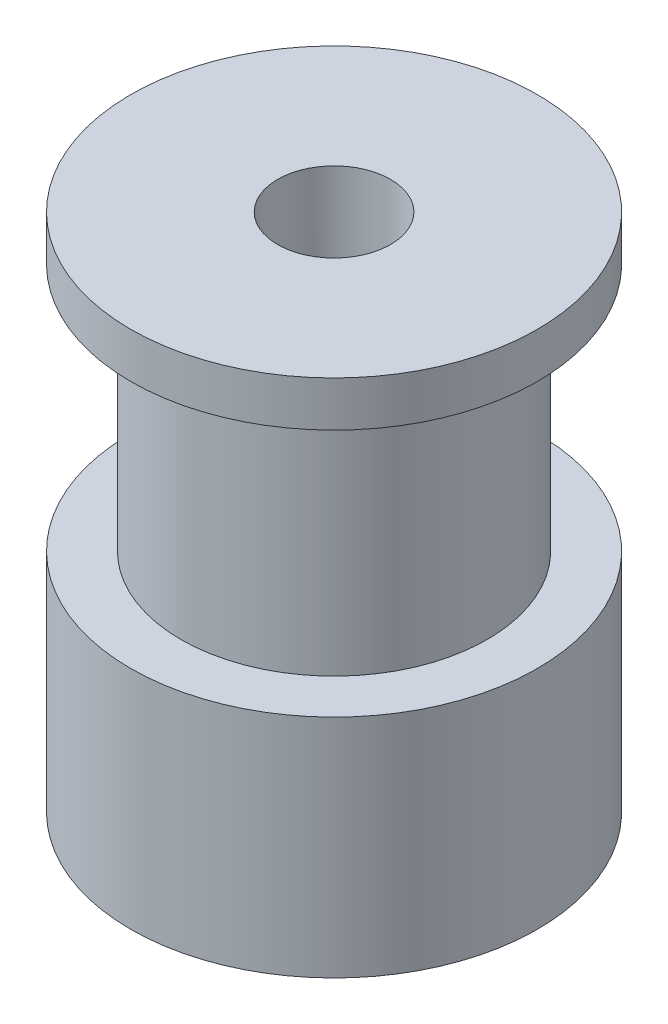
ISO-10303-21;
HEADER;
FILE_DESCRIPTION(('STEP AP214'),'2;1');
FILE_NAME('part.step','',(''),(''),'','','');
FILE_SCHEMA(('AUTOMOTIVE_DESIGN { 1 0 10303 214 1 1 1 1 }'));
ENDSEC;
DATA;
#1=APPLICATION_CONTEXT('core data for automotive mechanical design processes');
#2=APPLICATION_PROTOCOL_DEFINITION('international standard','automotive_design',2000,#1);
#3=PRODUCT_CONTEXT('',#1,'mechanical');
#4=PRODUCT('Part','Part','',(#3));
#5=PRODUCT_RELATED_PRODUCT_CATEGORY('part','',(#4));
#6=PRODUCT_DEFINITION_FORMATION('','',#4);
#7=PRODUCT_DEFINITION_CONTEXT('part definition',#1,'design');
#8=PRODUCT_DEFINITION('design','',#6,#7);
#9=PRODUCT_DEFINITION_SHAPE('','',#8);
#10=(LENGTH_UNIT() NAMED_UNIT(*) SI_UNIT(.MILLI.,.METRE.));
#11=(NAMED_UNIT(*) PLANE_ANGLE_UNIT() SI_UNIT($,.RADIAN.));
#12=(NAMED_UNIT(*) SI_UNIT($,.STERADIAN.) SOLID_ANGLE_UNIT());
#13=UNCERTAINTY_MEASURE_WITH_UNIT(LENGTH_MEASURE(1.E-05),#10,'distance_accuracy_value','');
#14=(GEOMETRIC_REPRESENTATION_CONTEXT(3) GLOBAL_UNCERTAINTY_ASSIGNED_CONTEXT((#13)) GLOBAL_UNIT_ASSIGNED_CONTEXT((#10,
#11,#12)) REPRESENTATION_CONTEXT('',''));
#15=CARTESIAN_POINT('',(0.,0.,0.));
#16=DIRECTION('',(0.,0.,1.));
#17=DIRECTION('',(1.,0.,0.));
#18=AXIS2_PLACEMENT_3D('',#15,#16,#17);
#19=CARTESIAN_POINT('',(0.,10.,0.));
#20=DIRECTION('',(0.,-1.,0.));
#21=DIRECTION('',(0.,0.,-1.));
#22=AXIS2_PLACEMENT_3D('',#19,#20,#21);
#23=CYLINDRICAL_SURFACE('',#22,9.);
#24=CARTESIAN_POINT('',(-9.,4.5,0.));
#25=CARTESIAN_POINT('',(-8.99999856701294,4.50000335336869,-0.0836345429749289));
#26=CARTESIAN_POINT('',(-8.9988220674782,4.50701836498135,-0.167314729103292));
#27=CARTESIAN_POINT('',(-8.99424206964832,4.53488139525919,-0.332328133003826));
#28=CARTESIAN_POINT('',(-8.99083652354334,4.55574213414696,-0.413659120775548));
#29=CARTESIAN_POINT('',(-8.9821804094187,4.61064926915565,-0.571562848327586));
#30=CARTESIAN_POINT('',(-8.97693135095516,4.64468487938434,-0.64813942105914));
#31=CARTESIAN_POINT('',(-8.96516536249242,4.72494737523144,-0.794485105186767));
#32=CARTESIAN_POINT('',(-8.9586485775266,4.7711728664898,-0.864254993927154));
#33=CARTESIAN_POINT('',(-8.94499990474988,4.87497305029228,-0.995683568575008));
#34=CARTESIAN_POINT('',(-8.93786323088914,4.93264146878168,-1.05726774212098));
#35=CARTESIAN_POINT('',(-8.92381576126039,5.05748878108369,-1.16993309919596));
#36=CARTESIAN_POINT('',(-8.916904979776,5.12466827487397,-1.22101361963458));
#37=CARTESIAN_POINT('',(-8.90404539455868,5.26714257971823,-1.31152027536308));
#38=CARTESIAN_POINT('',(-8.89810277454981,5.34248480208285,-1.3508727317166));
#39=CARTESIAN_POINT('',(-8.88791873876805,5.49882573858038,-1.41633501924673));
#40=CARTESIAN_POINT('',(-8.88367720808584,5.57982407020658,-1.44244574493937));
#41=CARTESIAN_POINT('',(-8.87742322105653,5.74438816491392,-1.48044862667088));
#42=CARTESIAN_POINT('',(-8.8753906109142,5.82792344190084,-1.49246941748124));
#43=CARTESIAN_POINT('',(-8.87372363361989,5.99584816613008,-1.50235003517393));
#44=CARTESIAN_POINT('',(-8.87408909674328,6.08023755250038,-1.5002108642334));
#45=CARTESIAN_POINT('',(-8.87715857318133,6.24655671676527,-1.48193705903769));
#46=CARTESIAN_POINT('',(-8.8798384399135,6.32850288212714,-1.46594692913386));
#47=CARTESIAN_POINT('',(-8.88719697126604,6.48853279069748,-1.42065188424207));
#48=CARTESIAN_POINT('',(-8.89187570443963,6.56661640133313,-1.39134651259184));
#49=CARTESIAN_POINT('',(-8.9027308760046,6.71713729406455,-1.32010634765635));
#50=CARTESIAN_POINT('',(-8.90891440264395,6.78954564364874,-1.27811154832783));
#51=CARTESIAN_POINT('',(-8.92207751049005,6.92634264032303,-1.18272721053446));
#52=CARTESIAN_POINT('',(-8.92905715592571,6.99073063947296,-1.12933675239257));
#53=CARTESIAN_POINT('',(-8.94313216727871,7.11049565148441,-1.01188932729543));
#54=CARTESIAN_POINT('',(-8.95022789538991,7.16575111112405,-0.947708378323875));
#55=CARTESIAN_POINT('',(-8.96365560838034,7.2647266575992,-0.810921149388987));
#56=CARTESIAN_POINT('',(-8.96998758833847,7.30844667010994,-0.738314815143853));
#57=CARTESIAN_POINT('',(-8.98118335735747,7.38312133628177,-0.586623549700026));
#58=CARTESIAN_POINT('',(-8.98604591044468,7.41406525159875,-0.507533235338796));
#59=CARTESIAN_POINT('',(-8.99374501807596,7.46219652914759,-0.345179007361638));
#60=CARTESIAN_POINT('',(-8.99658174210284,7.47938504218423,-0.26191544350768));
#61=CARTESIAN_POINT('',(-8.99988677905611,7.49935281507668,-0.0946259407809736));
#62=CARTESIAN_POINT('',(-9.00038251807671,7.50229894308336,-0.0106204422906062));
#63=CARTESIAN_POINT('',(-8.99902484652702,7.49414319334313,0.156683863733933));
#64=CARTESIAN_POINT('',(-8.99717152634471,7.48304185611976,0.239982698335224));
#65=CARTESIAN_POINT('',(-8.99134096162921,7.44724509039871,0.402993705328059));
#66=CARTESIAN_POINT('',(-8.98737662880786,7.42263227496592,0.482724521031228));
#67=CARTESIAN_POINT('',(-8.97776678673215,7.36059928908028,0.636928130916266));
#68=CARTESIAN_POINT('',(-8.97212118307212,7.32317839941884,0.711400629545832));
#69=CARTESIAN_POINT('',(-8.95970709781444,7.23620932518193,0.853698413681376));
#70=CARTESIAN_POINT('',(-8.95292913532213,7.18655690629965,0.92145915056229));
#71=CARTESIAN_POINT('',(-8.9390308043514,7.07667761076896,1.04774615130161));
#72=CARTESIAN_POINT('',(-8.93191041102928,7.016449966034,1.10627174381795));
#73=CARTESIAN_POINT('',(-8.91804105141507,6.88638147115715,1.2130456677948));
#74=CARTESIAN_POINT('',(-8.91129669682263,6.81644750069135,1.26118125666823));
#75=CARTESIAN_POINT('',(-8.8990291786673,6.66938821851688,1.34502138617699));
#76=CARTESIAN_POINT('',(-8.89350597639612,6.5922631348635,1.38072632086189));
#77=CARTESIAN_POINT('',(-8.88434072218623,6.43332616031272,1.43852299888389));
#78=CARTESIAN_POINT('',(-8.88069092586639,6.35153514298171,1.46067085952877));
#79=CARTESIAN_POINT('',(-8.87566630101156,6.18532792246694,1.49090127226697));
#80=CARTESIAN_POINT('',(-8.87429127469633,6.10091194816077,1.4989850471677));
#81=CARTESIAN_POINT('',(-8.87398039850406,5.93297690042255,1.50082371962841));
#82=CARTESIAN_POINT('',(-8.87501433903389,5.84945977285483,1.49475608167511));
#83=CARTESIAN_POINT('',(-8.87933868872237,5.68465245116954,1.46884790337411));
#84=CARTESIAN_POINT('',(-8.88262909056728,5.60336224983488,1.44900740766749));
#85=CARTESIAN_POINT('',(-8.89108413769031,5.44538493762443,1.39618469375694));
#86=CARTESIAN_POINT('',(-8.89624660331802,5.36869259396638,1.36321775436027));
#87=CARTESIAN_POINT('',(-8.90786621353324,5.22189859848309,1.28509620234955));
#88=CARTESIAN_POINT('',(-8.91432342233039,5.15179727377672,1.23994098524914));
#89=CARTESIAN_POINT('',(-8.92790072427373,5.01927865013535,1.13809133062329));
#90=CARTESIAN_POINT('',(-8.93502777345781,4.95696238997984,1.08126633815619));
#91=CARTESIAN_POINT('',(-8.94908623416505,4.84268903731504,0.957965418828138));
#92=CARTESIAN_POINT('',(-8.95601760015928,4.7907343388171,0.891487267747582));
#93=CARTESIAN_POINT('',(-8.96895917785332,4.69833103908003,0.750221501784169));
#94=CARTESIAN_POINT('',(-8.97496269751862,4.65796437641223,0.675379672519691));
#95=CARTESIAN_POINT('',(-8.98530700561065,4.59043830923405,0.519907841627389));
#96=CARTESIAN_POINT('',(-8.98964944906488,4.56326575135218,0.439283696898006));
#97=CARTESIAN_POINT('',(-8.99523474499773,4.528796835524,0.29862198602724));
#98=CARTESIAN_POINT('',(-8.99701216364015,4.51801531823042,0.239435298179068));
#99=CARTESIAN_POINT('',(-8.99939529591672,4.50361575729315,0.120173586191885));
#100=CARTESIAN_POINT('',(-9.00000102972385,4.49999759031758,0.0600985773650965));
#101=CARTESIAN_POINT('',(-9.,4.5,0.));
#102=B_SPLINE_CURVE_WITH_KNOTS('',3,(#24,#25,#26,#27,#28,#29,#30,#31,#32,#33,#34,#35,#36,#37,
#38,#39,#40,#41,#42,#43,#44,#45,#46,#47,#48,#49,#50,#51,#52,#53,#54,#55,#56,#57,#58,#59,#60,#61,
#62,#63,#64,#65,#66,#67,#68,#69,#70,#71,#72,#73,#74,#75,#76,#77,#78,#79,#80,#81,#82,#83,#84,#85,
#86,#87,#88,#89,#90,#91,#92,#93,#94,#95,#96,#97,#98,#99,#100,#101),.UNSPECIFIED.,.T.,.F.,(4,2,2,
2,2,2,2,2,2,2,2,2,2,2,2,2,2,2,2,2,2,2,2,2,2,2,2,2,2,2,2,2,2,2,2,2,2,2,4),(0.,0.250683950963106,
0.501598527417252,0.752308120215162,1.00298904760487,1.25581494637399,1.50865680101914,
1.76305512494304,2.01743626125709,2.26947646262054,2.52149882592532,2.77092313056245,
3.02035599015229,3.27098733979535,3.52163892408344,3.77539661946796,4.02915594981509,
4.28312813349542,4.53707906712689,4.78804730094838,5.03900587821516,5.2884468420385,
5.5379018149564,5.78956095376214,6.0412383783257,6.29552293204572,6.54979942425566,
6.80301613405063,7.05621082671971,7.3062474571362,7.5562832771288,7.80602890935734,
8.05578693017602,8.30850830516035,8.56128800327384,8.8158133896432,9.07008451278043,
9.25022548898411,9.43036336366181),.UNSPECIFIED.);
#103=CARTESIAN_POINT('',(-9.,4.5,0.));
#104=VERTEX_POINT('',#103);
#105=EDGE_CURVE('E79',#104,#104,#102,.T.);
#106=ORIENTED_EDGE('',*,*,#105,.T.);
#107=EDGE_LOOP('',(#106));
#108=FACE_BOUND('',#107,.T.);
#109=CARTESIAN_POINT('',(0.,7.5,-9.));
#110=CARTESIAN_POINT('',(-0.0836345429749289,7.49999664663131,-8.99999856701294));
#111=CARTESIAN_POINT('',(-0.167314729103292,7.49298163501865,-8.9988220674782));
#112=CARTESIAN_POINT('',(-0.332328133003826,7.46511860474081,-8.99424206964832));
#113=CARTESIAN_POINT('',(-0.413659120775548,7.44425786585304,-8.99083652354334));
#114=CARTESIAN_POINT('',(-0.571562848327586,7.38935073084435,-8.9821804094187));
#115=CARTESIAN_POINT('',(-0.64813942105914,7.35531512061566,-8.97693135095516));
#116=CARTESIAN_POINT('',(-0.794485105186767,7.27505262476856,-8.96516536249242));
#117=CARTESIAN_POINT('',(-0.864254993927155,7.2288271335102,-8.9586485775266));
#118=CARTESIAN_POINT('',(-0.995683568575008,7.12502694970772,-8.94499990474988));
#119=CARTESIAN_POINT('',(-1.05726774212098,7.06735853121832,-8.93786323088914));
#120=CARTESIAN_POINT('',(-1.16993309919596,6.94251121891631,-8.92381576126039));
#121=CARTESIAN_POINT('',(-1.22101361963458,6.87533172512603,-8.916904979776));
#122=CARTESIAN_POINT('',(-1.31152027536308,6.73285742028177,-8.90404539455868));
#123=CARTESIAN_POINT('',(-1.3508727317166,6.65751519791715,-8.89810277454981));
#124=CARTESIAN_POINT('',(-1.41633501924673,6.50117426141963,-8.88791873876805));
#125=CARTESIAN_POINT('',(-1.44244574493937,6.42017592979342,-8.88367720808584));
#126=CARTESIAN_POINT('',(-1.48044862667088,6.25561183508608,-8.87742322105653));
#127=CARTESIAN_POINT('',(-1.49246941748124,6.17207655809917,-8.8753906109142));
#128=CARTESIAN_POINT('',(-1.50235003517392,6.00415183386992,-8.87372363361989));
#129=CARTESIAN_POINT('',(-1.5002108642334,5.91976244749962,-8.87408909674328));
#130=CARTESIAN_POINT('',(-1.48193705903769,5.75344328323473,-8.87715857318133));
#131=CARTESIAN_POINT('',(-1.46594692913386,5.67149711787286,-8.8798384399135));
#132=CARTESIAN_POINT('',(-1.42065188424207,5.51146720930252,-8.88719697126604));
#133=CARTESIAN_POINT('',(-1.39134651259184,5.43338359866687,-8.89187570443963));
#134=CARTESIAN_POINT('',(-1.32010634765635,5.28286270593545,-8.9027308760046));
#135=CARTESIAN_POINT('',(-1.27811154832783,5.21045435635126,-8.90891440264395));
#136=CARTESIAN_POINT('',(-1.18272721053446,5.07365735967697,-8.92207751049005));
#137=CARTESIAN_POINT('',(-1.12933675239257,5.00926936052704,-8.92905715592571));
#138=CARTESIAN_POINT('',(-1.01188932729543,4.88950434851559,-8.94313216727871));
#139=CARTESIAN_POINT('',(-0.947708378323875,4.83424888887595,-8.95022789538991));
#140=CARTESIAN_POINT('',(-0.810921149388987,4.7352733424008,-8.96365560838034));
#141=CARTESIAN_POINT('',(-0.738314815143853,4.69155332989006,-8.96998758833847));
#142=CARTESIAN_POINT('',(-0.586623549700026,4.61687866371823,-8.98118335735747));
#143=CARTESIAN_POINT('',(-0.507533235338796,4.58593474840125,-8.98604591044468));
#144=CARTESIAN_POINT('',(-0.345179007361638,4.53780347085241,-8.99374501807596));
#145=CARTESIAN_POINT('',(-0.26191544350768,4.52061495781577,-8.99658174210284));
#146=CARTESIAN_POINT('',(-0.0946259407809735,4.50064718492332,-8.99988677905611));
#147=CARTESIAN_POINT('',(-0.0106204422906061,4.49770105691664,-9.00038251807671));
#148=CARTESIAN_POINT('',(0.156683863733933,4.50585680665687,-8.99902484652702));
#149=CARTESIAN_POINT('',(0.239982698335224,4.51695814388024,-8.99717152634471));
#150=CARTESIAN_POINT('',(0.402993705328059,4.55275490960129,-8.99134096162921));
#151=CARTESIAN_POINT('',(0.482724521031228,4.57736772503408,-8.98737662880786));
#152=CARTESIAN_POINT('',(0.636928130916266,4.63940071091972,-8.97776678673215));
#153=CARTESIAN_POINT('',(0.711400629545832,4.67682160058116,-8.97212118307212));
#154=CARTESIAN_POINT('',(0.853698413681376,4.76379067481807,-8.95970709781444));
#155=CARTESIAN_POINT('',(0.921459150562289,4.81344309370035,-8.95292913532213));
#156=CARTESIAN_POINT('',(1.04774615130161,4.92332238923104,-8.9390308043514));
#157=CARTESIAN_POINT('',(1.10627174381795,4.983550033966,-8.93191041102928));
#158=CARTESIAN_POINT('',(1.2130456677948,5.11361852884285,-8.91804105141507));
#159=CARTESIAN_POINT('',(1.26118125666823,5.18355249930865,-8.91129669682263));
#160=CARTESIAN_POINT('',(1.34502138617699,5.33061178148312,-8.8990291786673));
#161=CARTESIAN_POINT('',(1.38072632086189,5.4077368651365,-8.89350597639612));
#162=CARTESIAN_POINT('',(1.43852299888389,5.56667383968728,-8.88434072218623));
#163=CARTESIAN_POINT('',(1.46067085952877,5.64846485701829,-8.88069092586639));
#164=CARTESIAN_POINT('',(1.49090127226697,5.81467207753306,-8.87566630101156));
#165=CARTESIAN_POINT('',(1.4989850471677,5.89908805183923,-8.87429127469633));
#166=CARTESIAN_POINT('',(1.50082371962841,6.06702309957745,-8.87398039850406));
#167=CARTESIAN_POINT('',(1.49475608167511,6.15054022714517,-8.87501433903389));
#168=CARTESIAN_POINT('',(1.46884790337411,6.31534754883046,-8.87933868872237));
#169=CARTESIAN_POINT('',(1.44900740766749,6.39663775016512,-8.88262909056728));
#170=CARTESIAN_POINT('',(1.39618469375694,6.55461506237557,-8.89108413769031));
#171=CARTESIAN_POINT('',(1.36321775436027,6.63130740603362,-8.89624660331802));
#172=CARTESIAN_POINT('',(1.28509620234954,6.77810140151691,-8.90786621353324));
#173=CARTESIAN_POINT('',(1.23994098524914,6.84820272622328,-8.91432342233039));
#174=CARTESIAN_POINT('',(1.13809133062329,6.98072134986465,-8.92790072427373));
#175=CARTESIAN_POINT('',(1.08126633815619,7.04303761002017,-8.93502777345781));
#176=CARTESIAN_POINT('',(0.957965418828138,7.15731096268496,-8.94908623416505));
#177=CARTESIAN_POINT('',(0.891487267747582,7.2092656611829,-8.95601760015928));
#178=CARTESIAN_POINT('',(0.750221501784169,7.30166896091997,-8.96895917785332));
#179=CARTESIAN_POINT('',(0.675379672519691,7.34203562358777,-8.97496269751862));
#180=CARTESIAN_POINT('',(0.519907841627388,7.40956169076595,-8.98530700561065));
#181=CARTESIAN_POINT('',(0.439283696898006,7.43673424864782,-8.98964944906488));
#182=CARTESIAN_POINT('',(0.29862198602724,7.471203164476,-8.99523474499773));
#183=CARTESIAN_POINT('',(0.239435298179068,7.48198468176958,-8.99701216364015));
#184=CARTESIAN_POINT('',(0.120173586191885,7.49638424270685,-8.99939529591672));
#185=CARTESIAN_POINT('',(0.0600985773650961,7.50000240968242,-9.00000102972385));
#186=CARTESIAN_POINT('',(0.,7.5,-9.));
#187=B_SPLINE_CURVE_WITH_KNOTS('',3,(#109,#110,#111,#112,#113,#114,#115,#116,#117,#118,#119,
#120,#121,#122,#123,#124,#125,#126,#127,#128,#129,#130,#131,#132,#133,#134,#135,#136,#137,#138,
#139,#140,#141,#142,#143,#144,#145,#146,#147,#148,#149,#150,#151,#152,#153,#154,#155,#156,#157,
#158,#159,#160,#161,#162,#163,#164,#165,#166,#167,#168,#169,#170,#171,#172,#173,#174,#175,#176,
#177,#178,#179,#180,#181,#182,#183,#184,#185,#186),.UNSPECIFIED.,.T.,.F.,(4,2,2,2,2,2,2,2,2,2,2,
2,2,2,2,2,2,2,2,2,2,2,2,2,2,2,2,2,2,2,2,2,2,2,2,2,2,2,4),(0.,0.250683950963106,
0.501598527417252,0.752308120215162,1.00298904760487,1.25581494637399,1.50865680101914,
1.76305512494304,2.01743626125709,2.26947646262054,2.52149882592532,2.77092313056245,
3.02035599015229,3.27098733979535,3.52163892408344,3.77539661946796,4.02915594981509,
4.28312813349542,4.53707906712689,4.78804730094838,5.03900587821516,5.2884468420385,
5.5379018149564,5.78956095376214,6.0412383783257,6.29552293204572,6.54979942425566,
6.80301613405064,7.05621082671971,7.3062474571362,7.5562832771288,7.80602890935734,
8.05578693017602,8.30850830516035,8.56128800327383,8.8158133896432,9.07008451278043,
9.25022548898411,9.43036336366181),.UNSPECIFIED.);
#188=CARTESIAN_POINT('',(0.,7.5,-9.));
#189=VERTEX_POINT('',#188);
#190=EDGE_CURVE('E78',#189,#189,#187,.T.);
#191=ORIENTED_EDGE('',*,*,#190,.T.);
#192=EDGE_LOOP('',(#191));
#193=FACE_BOUND('',#192,.T.);
#194=CARTESIAN_POINT('',(0.,10.,0.));
#195=DIRECTION('',(0.,1.,0.));
#196=DIRECTION('',(0.,0.,1.));
#197=AXIS2_PLACEMENT_3D('',#194,#195,#196);
#198=CIRCLE('',#197,9.);
#199=CARTESIAN_POINT('',(0.,10.,9.));
#200=VERTEX_POINT('',#199);
#201=EDGE_CURVE('E57',#200,#200,#198,.T.);
#202=ORIENTED_EDGE('',*,*,#201,.F.);
#203=EDGE_LOOP('',(#202));
#204=FACE_BOUND('',#203,.T.);
#205=CARTESIAN_POINT('',(0.,0.,0.));
#206=DIRECTION('',(0.,1.,0.));
#207=DIRECTION('',(0.,0.,1.));
#208=AXIS2_PLACEMENT_3D('',#205,#206,#207);
#209=CIRCLE('',#208,9.);
#210=CARTESIAN_POINT('',(0.,0.,9.));
#211=VERTEX_POINT('',#210);
#212=EDGE_CURVE('E63',#211,#211,#209,.T.);
#213=ORIENTED_EDGE('',*,*,#212,.T.);
#214=EDGE_LOOP('',(#213));
#215=FACE_BOUND('',#214,.T.);
#216=ADVANCED_FACE('F43',(#108,#193,#204,#215),#23,.T.);
#217=CARTESIAN_POINT('',(0.,10.,0.));
#218=DIRECTION('',(0.,1.,0.));
#219=DIRECTION('',(0.,0.,1.));
#220=AXIS2_PLACEMENT_3D('',#217,#218,#219);
#221=PLANE('',#220);
#222=CARTESIAN_POINT('',(0.,10.,0.));
#223=DIRECTION('',(0.,1.,0.));
#224=DIRECTION('',(0.,0.,1.));
#225=AXIS2_PLACEMENT_3D('',#222,#223,#224);
#226=CIRCLE('',#225,6.78);
#227=CARTESIAN_POINT('',(0.,10.,6.78));
#228=VERTEX_POINT('',#227);
#229=EDGE_CURVE('E10',#228,#228,#226,.T.);
#230=ORIENTED_EDGE('',*,*,#229,.F.);
#231=EDGE_LOOP('',(#230));
#232=FACE_BOUND('',#231,.T.);
#233=ORIENTED_EDGE('',*,*,#201,.T.);
#234=EDGE_LOOP('',(#233));
#235=FACE_BOUND('',#234,.T.);
#236=ADVANCED_FACE('F135',(#232,#235),#221,.T.);
#237=CARTESIAN_POINT('',(0.,0.,0.));
#238=DIRECTION('',(0.,1.,0.));
#239=DIRECTION('',(0.,0.,1.));
#240=AXIS2_PLACEMENT_3D('',#237,#238,#239);
#241=PLANE('',#240);
#242=CARTESIAN_POINT('',(0.,0.,0.));
#243=DIRECTION('',(0.,-1.,0.));
#244=DIRECTION('',(0.,0.,-1.));
#245=AXIS2_PLACEMENT_3D('',#242,#243,#244);
#246=CIRCLE('',#245,2.5);
#247=CARTESIAN_POINT('',(0.,0.,-2.5));
#248=VERTEX_POINT('',#247);
#249=EDGE_CURVE('E98',#248,#248,#246,.T.);
#250=ORIENTED_EDGE('',*,*,#249,.F.);
#251=EDGE_LOOP('',(#250));
#252=FACE_BOUND('',#251,.T.);
#253=ORIENTED_EDGE('',*,*,#212,.F.);
#254=EDGE_LOOP('',(#253));
#255=FACE_BOUND('',#254,.T.);
#256=ADVANCED_FACE('F140',(#252,#255),#241,.F.);
#257=CARTESIAN_POINT('',(0.,21.,0.));
#258=DIRECTION('',(0.,-1.,0.));
#259=DIRECTION('',(0.,0.,-1.));
#260=AXIS2_PLACEMENT_3D('',#257,#258,#259);
#261=CYLINDRICAL_SURFACE('',#260,6.78);
#262=CARTESIAN_POINT('',(0.,21.,0.));
#263=DIRECTION('',(0.,1.,0.));
#264=DIRECTION('',(0.,0.,1.));
#265=AXIS2_PLACEMENT_3D('',#262,#263,#264);
#266=CIRCLE('',#265,6.78);
#267=CARTESIAN_POINT('',(0.,21.,6.78));
#268=VERTEX_POINT('',#267);
#269=EDGE_CURVE('E66',#268,#268,#266,.T.);
#270=ORIENTED_EDGE('',*,*,#269,.F.);
#271=EDGE_LOOP('',(#270));
#272=FACE_BOUND('',#271,.T.);
#273=ORIENTED_EDGE('',*,*,#229,.T.);
#274=EDGE_LOOP('',(#273));
#275=FACE_BOUND('',#274,.T.);
#276=ADVANCED_FACE('F152',(#272,#275),#261,.T.);
#277=CARTESIAN_POINT('',(0.,23.,0.));
#278=DIRECTION('',(0.,-1.,0.));
#279=DIRECTION('',(0.,0.,-1.));
#280=AXIS2_PLACEMENT_3D('',#277,#278,#279);
#281=CYLINDRICAL_SURFACE('',#280,9.);
#282=CARTESIAN_POINT('',(0.,23.,0.));
#283=DIRECTION('',(0.,1.,0.));
#284=DIRECTION('',(0.,0.,1.));
#285=AXIS2_PLACEMENT_3D('',#282,#283,#284);
#286=CIRCLE('',#285,9.);
#287=CARTESIAN_POINT('',(0.,23.,9.));
#288=VERTEX_POINT('',#287);
#289=EDGE_CURVE('E110',#288,#288,#286,.T.);
#290=ORIENTED_EDGE('',*,*,#289,.F.);
#291=EDGE_LOOP('',(#290));
#292=FACE_BOUND('',#291,.T.);
#293=CARTESIAN_POINT('',(0.,21.,0.));
#294=DIRECTION('',(0.,1.,0.));
#295=DIRECTION('',(0.,0.,1.));
#296=AXIS2_PLACEMENT_3D('',#293,#294,#295);
#297=CIRCLE('',#296,9.);
#298=CARTESIAN_POINT('',(0.,21.,9.));
#299=VERTEX_POINT('',#298);
#300=EDGE_CURVE('E106',#299,#299,#297,.T.);
#301=ORIENTED_EDGE('',*,*,#300,.T.);
#302=EDGE_LOOP('',(#301));
#303=FACE_BOUND('',#302,.T.);
#304=ADVANCED_FACE('F117',(#292,#303),#281,.T.);
#305=CARTESIAN_POINT('',(0.,23.,0.));
#306=DIRECTION('',(0.,1.,0.));
#307=DIRECTION('',(0.,0.,1.));
#308=AXIS2_PLACEMENT_3D('',#305,#306,#307);
#309=PLANE('',#308);
#310=CARTESIAN_POINT('',(0.,23.,0.));
#311=DIRECTION('',(0.,-1.,0.));
#312=DIRECTION('',(0.,0.,-1.));
#313=AXIS2_PLACEMENT_3D('',#310,#311,#312);
#314=CIRCLE('',#313,2.5);
#315=CARTESIAN_POINT('',(0.,23.,-2.5));
#316=VERTEX_POINT('',#315);
#317=EDGE_CURVE('E102',#316,#316,#314,.T.);
#318=ORIENTED_EDGE('',*,*,#317,.T.);
#319=EDGE_LOOP('',(#318));
#320=FACE_BOUND('',#319,.T.);
#321=ORIENTED_EDGE('',*,*,#289,.T.);
#322=EDGE_LOOP('',(#321));
#323=FACE_BOUND('',#322,.T.);
#324=ADVANCED_FACE('F121',(#320,#323),#309,.T.);
#325=CARTESIAN_POINT('',(0.,21.,0.));
#326=DIRECTION('',(0.,1.,0.));
#327=DIRECTION('',(0.,0.,1.));
#328=AXIS2_PLACEMENT_3D('',#325,#326,#327);
#329=PLANE('',#328);
#330=ORIENTED_EDGE('',*,*,#269,.T.);
#331=EDGE_LOOP('',(#330));
#332=FACE_BOUND('',#331,.T.);
#333=ORIENTED_EDGE('',*,*,#300,.F.);
#334=EDGE_LOOP('',(#333));
#335=FACE_BOUND('',#334,.T.);
#336=ADVANCED_FACE('F119',(#332,#335),#329,.F.);
#337=CARTESIAN_POINT('',(0.,23.,0.));
#338=DIRECTION('',(0.,-1.,0.));
#339=DIRECTION('',(0.,0.,-1.));
#340=AXIS2_PLACEMENT_3D('',#337,#338,#339);
#341=CYLINDRICAL_SURFACE('',#340,2.5);
#342=CARTESIAN_POINT('',(-2.,6.,-1.5));
#343=CARTESIAN_POINT('',(-1.99999416642511,5.92452102471036,-1.50000404108592));
#344=CARTESIAN_POINT('',(-2.00433633903481,5.8490615659202,-1.49426852824013));
#345=CARTESIAN_POINT('',(-2.02092590613883,5.70067609603778,-1.47174965152787));
#346=CARTESIAN_POINT('',(-2.03318155043097,5.6277528126149,-1.45495475788936));
#347=CARTESIAN_POINT('',(-2.0636233903473,5.48691635832272,-1.41143486335795));
#348=CARTESIAN_POINT('',(-2.0817666618312,5.41897116196473,-1.3847815450315));
#349=CARTESIAN_POINT('',(-2.12185904995836,5.28856254663208,-1.32252909283019));
#350=CARTESIAN_POINT('',(-2.14380930122416,5.22610077030486,-1.28692729054693));
#351=CARTESIAN_POINT('',(-2.19228594587542,5.10005098333592,-1.20271292747644));
#352=CARTESIAN_POINT('',(-2.21904371037662,5.03725904287606,-1.15304179435289));
#353=CARTESIAN_POINT('',(-2.27226229431061,4.92023523725825,-1.04426801309985));
#354=CARTESIAN_POINT('',(-2.29872287517103,4.8660098483292,-0.985158296729612));
#355=CARTESIAN_POINT('',(-2.35175567858734,4.7618661902903,-0.851442367411701));
#356=CARTESIAN_POINT('',(-2.37803133577818,4.71304553633025,-0.775851995162547));
#357=CARTESIAN_POINT('',(-2.42443786983179,4.62919027755557,-0.615654228271658));
#358=CARTESIAN_POINT('',(-2.44457437988735,4.59414302587729,-0.53105519662633));
#359=CARTESIAN_POINT('',(-2.4747098780044,4.54240407718735,-0.363771406742666));
#360=CARTESIAN_POINT('',(-2.4854930393917,4.5242796390327,-0.281674698130914));
#361=CARTESIAN_POINT('',(-2.49874939277545,4.50205719713688,-0.114970509382707));
#362=CARTESIAN_POINT('',(-2.50123038813308,4.49794602199995,-0.0303654624001524));
#363=CARTESIAN_POINT('',(-2.49783372711539,4.50361374734246,0.127637283737311));
#364=CARTESIAN_POINT('',(-2.49295437513726,4.51173352616931,0.201123832865636));
#365=CARTESIAN_POINT('',(-2.47707997553857,4.53847979564811,0.345464269151769));
#366=CARTESIAN_POINT('',(-2.46608447529309,4.55710706390716,0.416317961051203));
#367=CARTESIAN_POINT('',(-2.43884907201719,4.60416556270378,0.554056780469081));
#368=CARTESIAN_POINT('',(-2.42257910450824,4.632653061139,0.620916491037619));
#369=CARTESIAN_POINT('',(-2.38609637638748,4.69838461622554,0.748988660115612));
#370=CARTESIAN_POINT('',(-2.36588259201812,4.73563094705901,0.810199646208012));
#371=CARTESIAN_POINT('',(-2.32037925976362,4.82283909280445,0.933074267143201));
#372=CARTESIAN_POINT('',(-2.2947718295215,4.87378831173574,0.993918663198194));
#373=CARTESIAN_POINT('',(-2.24255554245601,4.98440411786018,1.10671465909275));
#374=CARTESIAN_POINT('',(-2.21594536703375,5.04408250347451,1.1586540130834));
#375=CARTESIAN_POINT('',(-2.16111075123946,5.17865340616355,1.25824837767417));
#376=CARTESIAN_POINT('',(-2.13305661385124,5.25450757653946,1.30470933188632));
#377=CARTESIAN_POINT('',(-2.08250879557267,5.41470623163661,1.38397217194232));
#378=CARTESIAN_POINT('',(-2.0600049029882,5.49903471612564,1.41679921962189));
#379=CARTESIAN_POINT('',(-2.02895865196731,5.65239363189535,1.46077497064843));
#380=CARTESIAN_POINT('',(-2.01833888618316,5.72004063229665,1.47527903312665));
#381=CARTESIAN_POINT('',(-2.00392150777558,5.85737361029948,1.49480872755284));
#382=CARTESIAN_POINT('',(-2.00011596115116,5.92705712048456,1.49984538302907));
#383=CARTESIAN_POINT('',(-1.99988914321323,6.06655168243571,1.50014781114183));
#384=CARTESIAN_POINT('',(-2.00347810223984,6.13636277721521,1.49540004697659));
#385=CARTESIAN_POINT('',(-2.01751520788652,6.27398734374856,1.47640290574941));
#386=CARTESIAN_POINT('',(-2.02796877613213,6.34179919224025,1.46214601830139));
#387=CARTESIAN_POINT('',(-2.054317683331,6.47371457947979,1.42488312618657));
#388=CARTESIAN_POINT('',(-2.07020622092812,6.53782263653223,1.40188805257362));
#389=CARTESIAN_POINT('',(-2.10571539417587,6.66147771573018,1.34796261057072));
#390=CARTESIAN_POINT('',(-2.12533743689999,6.721023006366,1.31702924888212));
#391=CARTESIAN_POINT('',(-2.17036819177737,6.84524008251225,1.24167439558512));
#392=CARTESIAN_POINT('',(-2.19618239397369,6.90890083509657,1.19582663060303));
#393=CARTESIAN_POINT('',(-2.2482175480362,7.02828548484946,1.09487395518701));
#394=CARTESIAN_POINT('',(-2.27443886711455,7.08400169216912,1.03976018672402));
#395=CARTESIAN_POINT('',(-2.32835625910913,7.19322400735043,0.913274837212767));
#396=CARTESIAN_POINT('',(-2.3558007587587,7.24550072660584,0.840721108780192));
#397=CARTESIAN_POINT('',(-2.40537639133459,7.33690277683665,0.686103100868021));
#398=CARTESIAN_POINT('',(-2.42751104449411,7.37603682784092,0.604045176134703));
#399=CARTESIAN_POINT('',(-2.46252280092775,7.43686820343137,0.438840232972139));
#400=CARTESIAN_POINT('',(-2.47595588067329,7.45962622779111,0.356205963651259));
#401=CARTESIAN_POINT('',(-2.494407389061,7.49071460284626,0.187383063890858));
#402=CARTESIAN_POINT('',(-2.49943534582737,7.49906129071762,0.101198571781969));
#403=CARTESIAN_POINT('',(-2.50040600461976,7.50067460858593,-0.0598120232009832));
#404=CARTESIAN_POINT('',(-2.49747057186327,7.49580333456303,-0.134620583589705));
#405=CARTESIAN_POINT('',(-2.48512948412095,7.47510617561839,-0.282148755978773));
#406=CARTESIAN_POINT('',(-2.47572375706639,7.4592801686784,-0.354868344701913));
#407=CARTESIAN_POINT('',(-2.45149427526962,7.41778042841621,-0.495145481978796));
#408=CARTESIAN_POINT('',(-2.43675966858906,7.39226840387076,-0.562767032608829));
#409=CARTESIAN_POINT('',(-2.40303337447155,7.33235940544525,-0.692781971999983));
#410=CARTESIAN_POINT('',(-2.38404073252268,7.2979604391404,-0.755174184199831));
#411=CARTESIAN_POINT('',(-2.34093432659381,7.21707480343124,-0.880263645295947));
#412=CARTESIAN_POINT('',(-2.31648844639149,7.16968129098313,-0.942258690439939));
#413=CARTESIAN_POINT('',(-2.26601907350661,7.06624696628228,-1.05789751536306));
#414=CARTESIAN_POINT('',(-2.23999385274509,7.01019657439209,-1.11153190956916));
#415=CARTESIAN_POINT('',(-2.18528165666204,6.8827144378223,-1.2159097535057));
#416=CARTESIAN_POINT('',(-2.15667566270901,6.8102335138345,-1.26542406663367));
#417=CARTESIAN_POINT('',(-2.10376464485145,6.65651514723346,-1.35156817210325));
#418=CARTESIAN_POINT('',(-2.07945738811052,6.57528228601859,-1.38820466322661));
#419=CARTESIAN_POINT('',(-2.0408000304796,6.4129357148628,-1.44437116535132));
#420=CARTESIAN_POINT('',(-2.02577665830138,6.33240476403876,-1.46509526060187));
#421=CARTESIAN_POINT('',(-2.00539032320036,6.16790260529632,-1.49289268240426));
#422=CARTESIAN_POINT('',(-2.00000648744643,6.08393923424129,-1.49999550595837));
#423=CARTESIAN_POINT('',(-2.,6.,-1.5));
#424=B_SPLINE_CURVE_WITH_KNOTS('',3,(#342,#343,#344,#345,#346,#347,#348,#349,#350,#351,#352,
#353,#354,#355,#356,#357,#358,#359,#360,#361,#362,#363,#364,#365,#366,#367,#368,#369,#370,#371,
#372,#373,#374,#375,#376,#377,#378,#379,#380,#381,#382,#383,#384,#385,#386,#387,#388,#389,#390,
#391,#392,#393,#394,#395,#396,#397,#398,#399,#400,#401,#402,#403,#404,#405,#406,#407,#408,#409,
#410,#411,#412,#413,#414,#415,#416,#417,#418,#419,#420,#421,#422,#423),.UNSPECIFIED.,.T.,.F.,(4,
2,2,2,2,2,2,2,2,2,2,2,2,2,2,2,2,2,2,2,2,2,2,2,2,2,2,2,2,2,2,2,2,2,2,2,2,2,2,2,4),(0.,
0.226085249493394,0.452406574330771,0.677113624991876,0.901887762215933,1.15414462390001,
1.40659128601844,1.68630157736223,1.9657544327122,2.21853330858497,2.47107452602767,
2.69230130543182,2.91354445887945,3.13607155036377,3.35865648368878,3.60782810055849,
3.85733966656908,4.13576671140276,4.41367760154768,4.62276298054684,4.83160475643976,
5.04073566011181,5.25003193304128,5.45906724365495,5.66818149154661,5.91499438482002,
6.16204457978454,6.44121828011588,6.72020638384847,6.97891479383337,7.23732973022726,
7.46129321849399,7.68525920139648,7.90563970188756,8.12606965394584,8.37042963549487,
8.61506198741955,8.89071695766604,9.16622832484805,9.41820120134354,9.66962780912277),.UNSPECIFIED.);
#425=CARTESIAN_POINT('',(-2.,6.,-1.5));
#426=VERTEX_POINT('',#425);
#427=EDGE_CURVE('E47',#426,#426,#424,.T.);
#428=ORIENTED_EDGE('',*,*,#427,.T.);
#429=EDGE_LOOP('',(#428));
#430=FACE_BOUND('',#429,.T.);
#431=CARTESIAN_POINT('',(0.,7.5,-2.5));
#432=CARTESIAN_POINT('',(0.0767298334620158,7.49999590899012,-2.49999625789732));
#433=CARTESIAN_POINT('',(0.153582320644178,7.49407132907374,-2.4964290461501));
#434=CARTESIAN_POINT('',(0.304975509530679,7.47067568048467,-2.48249903608568));
#435=CARTESIAN_POINT('',(0.379510034596047,7.45317613814578,-2.47211948032719));
#436=CARTESIAN_POINT('',(0.523751827790836,7.40761363883314,-2.44561558054488));
#437=CARTESIAN_POINT('',(0.593481028226565,7.37960304183684,-2.42951973272944));
#438=CARTESIAN_POINT('',(0.727030318214658,7.31413966685897,-2.39295367626407));
#439=CARTESIAN_POINT('',(0.790851869416383,7.27668923303125,-2.37248455380255));
#440=CARTESIAN_POINT('',(0.916299278999315,7.19022517329142,-2.32705360719088));
#441=CARTESIAN_POINT('',(0.977384020081415,7.14054630464861,-2.30186792195985));
#442=CARTESIAN_POINT('',(1.09088270411891,7.03253279617173,-2.25030439279634));
#443=CARTESIAN_POINT('',(1.14328534948112,6.97418706281268,-2.22392505153571));
#444=CARTESIAN_POINT('',(1.24444996762974,6.84207648950327,-2.1691106699591));
#445=CARTESIAN_POINT('',(1.29197766378809,6.76729822901871,-2.14082017703649));
#446=CARTESIAN_POINT('',(1.37361437764896,6.60915342675689,-2.08938301412124));
#447=CARTESIAN_POINT('',(1.4077451733516,6.52580110375243,-2.06622802273938));
#448=CARTESIAN_POINT('',(1.45440601714222,6.37340354934676,-2.0335462966093));
#449=CARTESIAN_POINT('',(1.47016197246826,6.30576400138968,-2.02207883137591));
#450=CARTESIAN_POINT('',(1.49216172340475,6.16819628416964,-2.00590308295503));
#451=CARTESIAN_POINT('',(1.49841734556836,6.09827107124551,-2.00118639643759));
#452=CARTESIAN_POINT('',(1.50105508796009,5.95798850578266,-1.99920922463856));
#453=CARTESIAN_POINT('',(1.49741783408419,5.8876305749068,-2.00196337012718));
#454=CARTESIAN_POINT('',(1.48046060478828,5.74872122457241,-2.01453261443741));
#455=CARTESIAN_POINT('',(1.46713334620103,5.68017120415256,-2.02435302432226));
#456=CARTESIAN_POINT('',(1.43173921881792,5.5474697578719,-2.04953186944258));
#457=CARTESIAN_POINT('',(1.40978748666087,5.48327294607552,-2.06481711652537));
#458=CARTESIAN_POINT('',(1.35795061770837,5.35930500907188,-2.09927051350828));
#459=CARTESIAN_POINT('',(1.32806257259705,5.29953551657608,-2.11844008623465));
#460=CARTESIAN_POINT('',(1.25517983184583,5.1750159028772,-2.16255327268985));
#461=CARTESIAN_POINT('',(1.21080724397723,5.11122190704507,-2.18792043372992));
#462=CARTESIAN_POINT('',(1.11291092784003,4.99132351633299,-2.23930599764381));
#463=CARTESIAN_POINT('',(1.05937845100579,4.93522656602349,-2.26532500262149));
#464=CARTESIAN_POINT('',(0.935811834382967,4.82438701817824,-2.31935504958317));
#465=CARTESIAN_POINT('',(0.864517682704958,4.77092269398401,-2.34713836268532));
#466=CARTESIAN_POINT('',(0.712276050459001,4.67687795280209,-2.3977242843398));
#467=CARTESIAN_POINT('',(0.631333763943565,4.63629064621005,-2.42052955425515));
#468=CARTESIAN_POINT('',(0.467197585268207,4.5720678172041,-2.45730392066151));
#469=CARTESIAN_POINT('',(0.384467624173581,4.54752464428409,-2.47173957439704));
#470=CARTESIAN_POINT('',(0.21504789514464,4.51298880259462,-2.49218842813551));
#471=CARTESIAN_POINT('',(0.128363005661319,4.50297868224642,-2.49821172952738));
#472=CARTESIAN_POINT('',(-0.033714614377396,4.49849215232169,-2.5009057037461));
#473=CARTESIAN_POINT('',(-0.109042473418718,4.50209114491483,-2.49873521714286));
#474=CARTESIAN_POINT('',(-0.25782940198606,4.52042585307192,-2.48778712087048));
#475=CARTESIAN_POINT('',(-0.331288509376105,4.53516134280581,-2.47900964518037));
#476=CARTESIAN_POINT('',(-0.472574932157612,4.57454343281246,-2.4559479244219));
#477=CARTESIAN_POINT('',(-0.540495750928483,4.59894034907347,-2.44180275662555));
#478=CARTESIAN_POINT('',(-0.671265749087262,4.65667737636527,-2.40913880862845));
#479=CARTESIAN_POINT('',(-0.734113924963908,4.69001925134667,-2.39061916586511));
#480=CARTESIAN_POINT('',(-0.860006262823863,4.7685569792087,-2.3484549623736));
#481=CARTESIAN_POINT('',(-0.922394150456836,4.81462382907839,-2.3244780273988));
#482=CARTESIAN_POINT('',(-1.03902603131014,4.91539139348862,-2.27474265574732));
#483=CARTESIAN_POINT('',(-1.09326040273738,4.97010215485254,-2.2489821658636));
#484=CARTESIAN_POINT('',(-1.19931996735579,5.09491039003715,-2.19445423909891));
#485=CARTESIAN_POINT('',(-1.24991019630915,5.1660838854655,-2.16573241746291));
#486=CARTESIAN_POINT('',(-1.33845238915667,5.3172160245682,-2.1121618206671));
#487=CARTESIAN_POINT('',(-1.37641766769781,5.39716529389278,-2.0873089799769));
#488=CARTESIAN_POINT('',(-1.43142578795776,5.54624302230669,-2.04984909240519));
#489=CARTESIAN_POINT('',(-1.4512162533619,5.61398031235859,-2.03575659328729));
#490=CARTESIAN_POINT('',(-1.48113663905972,5.7525320780801,-2.01409605743544));
#491=CARTESIAN_POINT('',(-1.49127995297631,5.82334214432783,-2.00651897642721));
#492=CARTESIAN_POINT('',(-1.50134130416631,5.96637694759703,-1.99900446616268));
#493=CARTESIAN_POINT('',(-1.50122089107869,6.03860599068704,-1.99909576445937));
#494=CARTESIAN_POINT('',(-1.49066472959328,6.18189443560946,-2.0069771789285));
#495=CARTESIAN_POINT('',(-1.48022337215759,6.25295318008059,-2.0147714813882));
#496=CARTESIAN_POINT('',(-1.45040174148913,6.38848841757218,-2.0363318524298));
#497=CARTESIAN_POINT('',(-1.43147636845351,6.45311709430687,-2.04979211805581));
#498=CARTESIAN_POINT('',(-1.38563242076993,6.57833725447422,-2.08105501960151));
#499=CARTESIAN_POINT('',(-1.35871083588479,6.63892720696055,-2.09885929040482));
#500=CARTESIAN_POINT('',(-1.29289245555732,6.76431985722078,-2.14012990550916));
#501=CARTESIAN_POINT('',(-1.25279167675753,6.82834110385431,-2.16404587582639));
#502=CARTESIAN_POINT('',(-1.16375698389085,6.94938007261729,-2.21320127030768));
#503=CARTESIAN_POINT('',(-1.11481579607798,7.00639196215256,-2.23844177205021));
#504=CARTESIAN_POINT('',(-1.00009777425734,7.12135094913167,-2.29225690291476));
#505=CARTESIAN_POINT('',(-0.932876819313906,7.17793107489619,-2.32070308663658));
#506=CARTESIAN_POINT('',(-0.788462434445591,7.2790978558633,-2.37365428872367));
#507=CARTESIAN_POINT('',(-0.711265444501542,7.32368021198479,-2.39815789310936));
#508=CARTESIAN_POINT('',(-0.551125230801456,7.39778580757374,-2.43985578654394));
#509=CARTESIAN_POINT('',(-0.468430086957216,7.42772806492683,-2.45725077479787));
#510=CARTESIAN_POINT('',(-0.29797330611881,7.47272469521097,-2.48366273001246));
#511=CARTESIAN_POINT('',(-0.210232099648615,7.48783516785699,-2.49271125871485));
#512=CARTESIAN_POINT('',(-0.101558096917538,7.49669745470866,-2.49802001168187));
#513=CARTESIAN_POINT('',(-0.0812762590282784,7.4979344173061,-2.49876114656362));
#514=CARTESIAN_POINT('',(-0.0406658206871126,7.49958624637086,-2.49975164517367));
#515=CARTESIAN_POINT('',(-0.0203372186375695,7.5000010843209,-2.50000099184316));
#516=CARTESIAN_POINT('',(0.,7.5,-2.5));
#517=B_SPLINE_CURVE_WITH_KNOTS('',3,(#431,#432,#433,#434,#435,#436,#437,#438,#439,#440,#441,
#442,#443,#444,#445,#446,#447,#448,#449,#450,#451,#452,#453,#454,#455,#456,#457,#458,#459,#460,
#461,#462,#463,#464,#465,#466,#467,#468,#469,#470,#471,#472,#473,#474,#475,#476,#477,#478,#479,
#480,#481,#482,#483,#484,#485,#486,#487,#488,#489,#490,#491,#492,#493,#494,#495,#496,#497,#498,
#499,#500,#501,#502,#503,#504,#505,#506,#507,#508,#509,#510,#511,#512,#513,#514,#515,#516),
.UNSPECIFIED.,.T.,.F.,(4,2,2,2,2,2,2,2,2,2,2,2,2,2,2,2,2,2,2,2,2,2,2,2,2,2,2,2,2,2,2,2,2,2,2,2,
2,2,2,2,2,2,4),(0.,0.230102237548649,0.460772627520012,0.690308884600011,0.919788197992274,
1.16681590732472,1.414162579348,1.69183813189807,1.96906040692092,2.17933829855633,
2.38935420916578,2.59978170870726,2.81036753273872,3.01823267593207,3.22617409809868,
3.47046995225163,3.71500044803674,3.99360957884691,4.27206939275324,4.53296790696559,
4.79355286918236,5.01875602722426,5.24395461863455,5.46367785689772,5.68344445659025,
5.92601365818362,6.16886690081836,6.44336762428009,6.71757792616456,6.93257787314692,
7.14727888733318,7.36278425777433,7.57840681155725,7.78364098331141,7.98895251523034,
8.22578610052286,8.46281544370207,8.73854311775518,9.01436946031985,9.28175654462676,
9.54812832184448,9.60911473335177,9.6701032602764),.UNSPECIFIED.);
#518=CARTESIAN_POINT('',(0.,7.5,-2.5));
#519=VERTEX_POINT('',#518);
#520=EDGE_CURVE('E71',#519,#519,#517,.T.);
#521=ORIENTED_EDGE('',*,*,#520,.T.);
#522=EDGE_LOOP('',(#521));
#523=FACE_BOUND('',#522,.T.);
#524=ORIENTED_EDGE('',*,*,#317,.F.);
#525=EDGE_LOOP('',(#524));
#526=FACE_BOUND('',#525,.T.);
#527=ORIENTED_EDGE('',*,*,#249,.T.);
#528=EDGE_LOOP('',(#527));
#529=FACE_BOUND('',#528,.T.);
#530=ADVANCED_FACE('F80',(#430,#523,#526,#529),#341,.F.);
#531=CARTESIAN_POINT('',(0.,6.,-9.));
#532=DIRECTION('',(0.,0.,1.));
#533=DIRECTION('',(1.,0.,0.));
#534=AXIS2_PLACEMENT_3D('',#531,#532,#533);
#535=CYLINDRICAL_SURFACE('',#534,1.5);
#536=ORIENTED_EDGE('',*,*,#520,.F.);
#537=EDGE_LOOP('',(#536));
#538=FACE_BOUND('',#537,.T.);
#539=ORIENTED_EDGE('',*,*,#190,.F.);
#540=EDGE_LOOP('',(#539));
#541=FACE_BOUND('',#540,.T.);
#542=ADVANCED_FACE('F83',(#538,#541),#535,.F.);
#543=CARTESIAN_POINT('',(-9.,6.,0.));
#544=DIRECTION('',(1.,0.,0.));
#545=DIRECTION('',(0.,0.,-1.));
#546=AXIS2_PLACEMENT_3D('',#543,#544,#545);
#547=CYLINDRICAL_SURFACE('',#546,1.5);
#548=ORIENTED_EDGE('',*,*,#427,.F.);
#549=EDGE_LOOP('',(#548));
#550=FACE_BOUND('',#549,.T.);
#551=ORIENTED_EDGE('',*,*,#105,.F.);
#552=EDGE_LOOP('',(#551));
#553=FACE_BOUND('',#552,.T.);
#554=ADVANCED_FACE('F86',(#550,#553),#547,.F.);
#555=CLOSED_SHELL('',(#216,#236,#256,#276,#304,#324,#336,#530,#542,#554));
#556=MANIFOLD_SOLID_BREP('B2',#555);
#557=ADVANCED_BREP_SHAPE_REPRESENTATION('',(#18,#556),#14);
#558=SHAPE_DEFINITION_REPRESENTATION(#9,#557);
ENDSEC;
END-ISO-10303-21;
